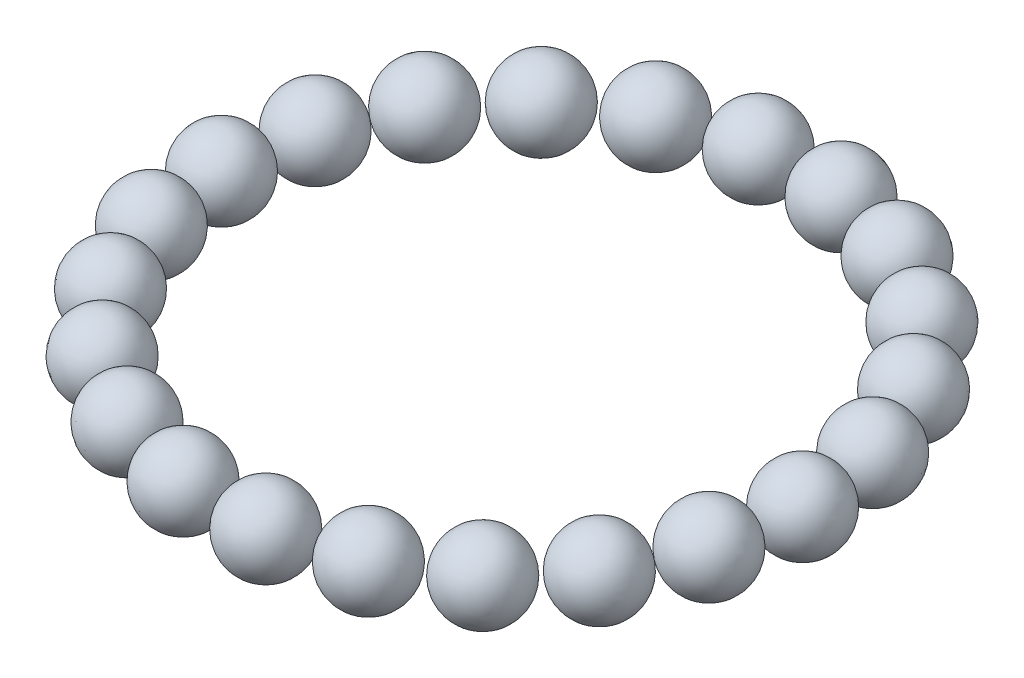
ISO-10303-21;
HEADER;
FILE_DESCRIPTION(('STEP AP214'),'2;1');
FILE_NAME('part.step','',(''),(''),'','','');
FILE_SCHEMA(('AUTOMOTIVE_DESIGN { 1 0 10303 214 1 1 1 1 }'));
ENDSEC;
DATA;
#1=APPLICATION_CONTEXT('core data for automotive mechanical design processes');
#2=APPLICATION_PROTOCOL_DEFINITION('international standard','automotive_design',2000,#1);
#3=PRODUCT_CONTEXT('',#1,'mechanical');
#4=PRODUCT('Part','Part','',(#3));
#5=PRODUCT_RELATED_PRODUCT_CATEGORY('part','',(#4));
#6=PRODUCT_DEFINITION_FORMATION('','',#4);
#7=PRODUCT_DEFINITION_CONTEXT('part definition',#1,'design');
#8=PRODUCT_DEFINITION('design','',#6,#7);
#9=PRODUCT_DEFINITION_SHAPE('','',#8);
#10=(LENGTH_UNIT() NAMED_UNIT(*) SI_UNIT(.MILLI.,.METRE.));
#11=(NAMED_UNIT(*) PLANE_ANGLE_UNIT() SI_UNIT($,.RADIAN.));
#12=(NAMED_UNIT(*) SI_UNIT($,.STERADIAN.) SOLID_ANGLE_UNIT());
#13=UNCERTAINTY_MEASURE_WITH_UNIT(LENGTH_MEASURE(1.E-05),#10,'distance_accuracy_value','');
#14=(GEOMETRIC_REPRESENTATION_CONTEXT(3) GLOBAL_UNCERTAINTY_ASSIGNED_CONTEXT((#13)) GLOBAL_UNIT_ASSIGNED_CONTEXT((#10,
#11,#12)) REPRESENTATION_CONTEXT('',''));
#15=CARTESIAN_POINT('',(0.,0.,0.));
#16=DIRECTION('',(0.,0.,1.));
#17=DIRECTION('',(1.,0.,0.));
#18=AXIS2_PLACEMENT_3D('',#15,#16,#17);
#19=CARTESIAN_POINT('',(22.2995761997745,0.,-6.54774635355182));
#20=DIRECTION('',(0.,1.,0.));
#21=DIRECTION('',(0.959492973614495,0.,-0.281732556841437));
#22=AXIS2_PLACEMENT_3D('',#19,#20,#21);
#23=SPHERICAL_SURFACE('',#22,3.175);
#24=CARTESIAN_POINT('',(22.2995761997745,3.175,-6.54774635355182));
#25=VERTEX_POINT('',#24);
#26=VERTEX_LOOP('',#25);
#27=FACE_BOUND('',#26,.T.);
#28=ADVANCED_FACE('P0_F13',(#27),#23,.T.);
#29=CLOSED_SHELL('',(#28));
#30=MANIFOLD_SOLID_BREP('P0_B1',#29);
#31=CARTESIAN_POINT('',(-23.241,0.,0.));
#32=DIRECTION('',(0.,1.,0.));
#33=DIRECTION('',(-1.,0.,0.));
#34=AXIS2_PLACEMENT_3D('',#31,#32,#33);
#35=SPHERICAL_SURFACE('',#34,3.175);
#36=CARTESIAN_POINT('',(-23.241,3.175,0.));
#37=VERTEX_POINT('',#36);
#38=VERTEX_LOOP('',#37);
#39=FACE_BOUND('',#38,.T.);
#40=ADVANCED_FACE('P1_F13',(#39),#35,.T.);
#41=CLOSED_SHELL('',(#40));
#42=MANIFOLD_SOLID_BREP('P1_B1',#41);
#43=CARTESIAN_POINT('',(19.5515733565294,0.,-12.5650332384857));
#44=DIRECTION('',(0.,1.,0.));
#45=DIRECTION('',(0.841253532831177,0.,-0.540640817455604));
#46=AXIS2_PLACEMENT_3D('',#43,#44,#45);
#47=SPHERICAL_SURFACE('',#46,3.175);
#48=CARTESIAN_POINT('',(19.5515733565294,3.175,-12.5650332384857));
#49=VERTEX_POINT('',#48);
#50=VERTEX_LOOP('',#49);
#51=FACE_BOUND('',#50,.T.);
#52=ADVANCED_FACE('P2_F13',(#51),#47,.T.);
#53=CLOSED_SHELL('',(#52));
#54=MANIFOLD_SOLID_BREP('P2_B1',#53);
#55=CARTESIAN_POINT('',(-22.2995761997745,0.,6.54774635355168));
#56=DIRECTION('',(0.,1.,0.));
#57=DIRECTION('',(-0.959492973614497,0.,0.28173255684143));
#58=AXIS2_PLACEMENT_3D('',#55,#56,#57);
#59=SPHERICAL_SURFACE('',#58,3.175);
#60=CARTESIAN_POINT('',(-22.2995761997745,3.175,6.54774635355168));
#61=VERTEX_POINT('',#60);
#62=VERTEX_LOOP('',#61);
#63=FACE_BOUND('',#62,.T.);
#64=ADVANCED_FACE('P3_F13',(#63),#59,.T.);
#65=CLOSED_SHELL('',(#64));
#66=MANIFOLD_SOLID_BREP('P3_B1',#65);
#67=CARTESIAN_POINT('',(15.2196183176222,0.,-17.5643758575674));
#68=DIRECTION('',(0.,1.,0.));
#69=DIRECTION('',(0.654860733945279,0.,-0.755749574354264));
#70=AXIS2_PLACEMENT_3D('',#67,#68,#69);
#71=SPHERICAL_SURFACE('',#70,3.175);
#72=CARTESIAN_POINT('',(15.2196183176222,3.175,-17.5643758575674));
#73=VERTEX_POINT('',#72);
#74=VERTEX_LOOP('',#73);
#75=FACE_BOUND('',#74,.T.);
#76=ADVANCED_FACE('P4_F13',(#75),#71,.T.);
#77=CLOSED_SHELL('',(#76));
#78=MANIFOLD_SOLID_BREP('P4_B1',#77);
#79=CARTESIAN_POINT('',(-19.5515733565295,0.,12.5650332384856));
#80=DIRECTION('',(0.,1.,0.));
#81=DIRECTION('',(-0.841253532831181,0.,0.540640817455599));
#82=AXIS2_PLACEMENT_3D('',#79,#80,#81);
#83=SPHERICAL_SURFACE('',#82,3.175);
#84=CARTESIAN_POINT('',(-19.5515733565295,3.175,12.5650332384856));
#85=VERTEX_POINT('',#84);
#86=VERTEX_LOOP('',#85);
#87=FACE_BOUND('',#86,.T.);
#88=ADVANCED_FACE('P5_F13',(#87),#83,.T.);
#89=CLOSED_SHELL('',(#88));
#90=MANIFOLD_SOLID_BREP('P5_B1',#89);
#91=CARTESIAN_POINT('',(9.65466031717665,0.,-21.1407572040344));
#92=DIRECTION('',(0.,1.,0.));
#93=DIRECTION('',(0.415415013001878,0.,-0.909631995354522));
#94=AXIS2_PLACEMENT_3D('',#91,#92,#93);
#95=SPHERICAL_SURFACE('',#94,3.175);
#96=CARTESIAN_POINT('',(9.65466031717665,3.175,-21.1407572040344));
#97=VERTEX_POINT('',#96);
#98=VERTEX_LOOP('',#97);
#99=FACE_BOUND('',#98,.T.);
#100=ADVANCED_FACE('P6_F13',(#99),#95,.T.);
#101=CLOSED_SHELL('',(#100));
#102=MANIFOLD_SOLID_BREP('P6_B1',#101);
#103=CARTESIAN_POINT('',(-15.2196183176223,0.,17.5643758575673));
#104=DIRECTION('',(0.,1.,0.));
#105=DIRECTION('',(-0.654860733945284,0.,0.75574957435426));
#106=AXIS2_PLACEMENT_3D('',#103,#104,#105);
#107=SPHERICAL_SURFACE('',#106,3.175);
#108=CARTESIAN_POINT('',(-15.2196183176223,3.175,17.5643758575673));
#109=VERTEX_POINT('',#108);
#110=VERTEX_LOOP('',#109);
#111=FACE_BOUND('',#110,.T.);
#112=ADVANCED_FACE('P7_F13',(#111),#107,.T.);
#113=CLOSED_SHELL('',(#112));
#114=MANIFOLD_SOLID_BREP('P7_B1',#113);
#115=CARTESIAN_POINT('',(3.3075391563092,0.,-23.0044401307548));
#116=DIRECTION('',(0.,1.,0.));
#117=DIRECTION('',(0.142314838273276,0.,-0.989821441880934));
#118=AXIS2_PLACEMENT_3D('',#115,#116,#117);
#119=SPHERICAL_SURFACE('',#118,3.175);
#120=CARTESIAN_POINT('',(3.3075391563092,3.175,-23.0044401307548));
#121=VERTEX_POINT('',#120);
#122=VERTEX_LOOP('',#121);
#123=FACE_BOUND('',#122,.T.);
#124=ADVANCED_FACE('P8_F13',(#123),#119,.T.);
#125=CLOSED_SHELL('',(#124));
#126=MANIFOLD_SOLID_BREP('P8_B1',#125);
#127=CARTESIAN_POINT('',(-9.65466031717679,0.,21.1407572040344));
#128=DIRECTION('',(0.,1.,0.));
#129=DIRECTION('',(-0.415415013001884,0.,0.90963199535452));
#130=AXIS2_PLACEMENT_3D('',#127,#128,#129);
#131=SPHERICAL_SURFACE('',#130,3.175);
#132=CARTESIAN_POINT('',(-9.65466031717679,3.175,21.1407572040344));
#133=VERTEX_POINT('',#132);
#134=VERTEX_LOOP('',#133);
#135=FACE_BOUND('',#134,.T.);
#136=ADVANCED_FACE('P9_F13',(#135),#131,.T.);
#137=CLOSED_SHELL('',(#136));
#138=MANIFOLD_SOLID_BREP('P9_B1',#137);
#139=CARTESIAN_POINT('',(-3.30753915630965,0.,-23.0044401307547));
#140=DIRECTION('',(0.,1.,0.));
#141=DIRECTION('',(-0.142314838273295,0.,-0.989821441880931));
#142=AXIS2_PLACEMENT_3D('',#139,#140,#141);
#143=SPHERICAL_SURFACE('',#142,3.175);
#144=CARTESIAN_POINT('',(-3.30753915630965,3.175,-23.0044401307547));
#145=VERTEX_POINT('',#144);
#146=VERTEX_LOOP('',#145);
#147=FACE_BOUND('',#146,.T.);
#148=ADVANCED_FACE('P10_F13',(#147),#143,.T.);
#149=CLOSED_SHELL('',(#148));
#150=MANIFOLD_SOLID_BREP('P10_B1',#149);
#151=CARTESIAN_POINT('',(-3.30753915630935,0.,23.0044401307548));
#152=DIRECTION('',(0.,1.,0.));
#153=DIRECTION('',(-0.142314838273282,0.,0.989821441880934));
#154=AXIS2_PLACEMENT_3D('',#151,#152,#153);
#155=SPHERICAL_SURFACE('',#154,3.175);
#156=CARTESIAN_POINT('',(-3.30753915630935,3.175,23.0044401307548));
#157=VERTEX_POINT('',#156);
#158=VERTEX_LOOP('',#157);
#159=FACE_BOUND('',#158,.T.);
#160=ADVANCED_FACE('P11_F13',(#159),#155,.T.);
#161=CLOSED_SHELL('',(#160));
#162=MANIFOLD_SOLID_BREP('P11_B1',#161);
#163=CARTESIAN_POINT('',(-9.65466031717707,0.,-21.1407572040342));
#164=DIRECTION('',(0.,1.,0.));
#165=DIRECTION('',(-0.415415013001897,0.,-0.909631995354514));
#166=AXIS2_PLACEMENT_3D('',#163,#164,#165);
#167=SPHERICAL_SURFACE('',#166,3.175);
#168=CARTESIAN_POINT('',(-9.65466031717707,3.175,-21.1407572040342));
#169=VERTEX_POINT('',#168);
#170=VERTEX_LOOP('',#169);
#171=FACE_BOUND('',#170,.T.);
#172=ADVANCED_FACE('P12_F13',(#171),#167,.T.);
#173=CLOSED_SHELL('',(#172));
#174=MANIFOLD_SOLID_BREP('P12_B1',#173);
#175=CARTESIAN_POINT('',(3.3075391563095,0.,23.0044401307547));
#176=DIRECTION('',(0.,1.,0.));
#177=DIRECTION('',(0.142314838273289,0.,0.989821441880932));
#178=AXIS2_PLACEMENT_3D('',#175,#176,#177);
#179=SPHERICAL_SURFACE('',#178,3.175);
#180=CARTESIAN_POINT('',(3.3075391563095,3.175,23.0044401307547));
#181=VERTEX_POINT('',#180);
#182=VERTEX_LOOP('',#181);
#183=FACE_BOUND('',#182,.T.);
#184=ADVANCED_FACE('P13_F13',(#183),#179,.T.);
#185=CLOSED_SHELL('',(#184));
#186=MANIFOLD_SOLID_BREP('P13_B1',#185);
#187=CARTESIAN_POINT('',(9.65466031717692,0.,21.1407572040343));
#188=DIRECTION('',(0.,1.,0.));
#189=DIRECTION('',(0.41541501300189,0.,0.909631995354517));
#190=AXIS2_PLACEMENT_3D('',#187,#188,#189);
#191=SPHERICAL_SURFACE('',#190,3.175);
#192=CARTESIAN_POINT('',(9.65466031717692,3.175,21.1407572040343));
#193=VERTEX_POINT('',#192);
#194=VERTEX_LOOP('',#193);
#195=FACE_BOUND('',#194,.T.);
#196=ADVANCED_FACE('P14_F13',(#195),#191,.T.);
#197=CLOSED_SHELL('',(#196));
#198=MANIFOLD_SOLID_BREP('P14_B1',#197);
#199=CARTESIAN_POINT('',(15.2196183176224,0.,17.5643758575672));
#200=DIRECTION('',(0.,1.,0.));
#201=DIRECTION('',(0.654860733945289,0.,0.755749574354255));
#202=AXIS2_PLACEMENT_3D('',#199,#200,#201);
#203=SPHERICAL_SURFACE('',#202,3.175);
#204=CARTESIAN_POINT('',(15.2196183176224,3.175,17.5643758575672));
#205=VERTEX_POINT('',#204);
#206=VERTEX_LOOP('',#205);
#207=FACE_BOUND('',#206,.T.);
#208=ADVANCED_FACE('P15_F13',(#207),#203,.T.);
#209=CLOSED_SHELL('',(#208));
#210=MANIFOLD_SOLID_BREP('P15_B1',#209);
#211=CARTESIAN_POINT('',(-15.2196183176226,0.,-17.5643758575671));
#212=DIRECTION('',(0.,1.,0.));
#213=DIRECTION('',(-0.654860733945294,0.,-0.755749574354251));
#214=AXIS2_PLACEMENT_3D('',#211,#212,#213);
#215=SPHERICAL_SURFACE('',#214,3.175);
#216=CARTESIAN_POINT('',(-15.2196183176226,3.175,-17.5643758575671));
#217=VERTEX_POINT('',#216);
#218=VERTEX_LOOP('',#217);
#219=FACE_BOUND('',#218,.T.);
#220=ADVANCED_FACE('P16_F13',(#219),#215,.T.);
#221=CLOSED_SHELL('',(#220));
#222=MANIFOLD_SOLID_BREP('P16_B1',#221);
#223=CARTESIAN_POINT('',(-19.5515733565296,0.,-12.5650332384853));
#224=DIRECTION('',(0.,1.,0.));
#225=DIRECTION('',(-0.841253532831188,0.,-0.540640817455587));
#226=AXIS2_PLACEMENT_3D('',#223,#224,#225);
#227=SPHERICAL_SURFACE('',#226,3.175);
#228=CARTESIAN_POINT('',(-19.5515733565296,3.175,-12.5650332384853));
#229=VERTEX_POINT('',#228);
#230=VERTEX_LOOP('',#229);
#231=FACE_BOUND('',#230,.T.);
#232=ADVANCED_FACE('P17_F13',(#231),#227,.T.);
#233=CLOSED_SHELL('',(#232));
#234=MANIFOLD_SOLID_BREP('P17_B1',#233);
#235=CARTESIAN_POINT('',(19.5515733565295,0.,12.5650332384854));
#236=DIRECTION('',(0.,1.,0.));
#237=DIRECTION('',(0.841253532831184,0.,0.540640817455593));
#238=AXIS2_PLACEMENT_3D('',#235,#236,#237);
#239=SPHERICAL_SURFACE('',#238,3.175);
#240=CARTESIAN_POINT('',(19.5515733565295,3.175,12.5650332384854));
#241=VERTEX_POINT('',#240);
#242=VERTEX_LOOP('',#241);
#243=FACE_BOUND('',#242,.T.);
#244=ADVANCED_FACE('P18_F13',(#243),#239,.T.);
#245=CLOSED_SHELL('',(#244));
#246=MANIFOLD_SOLID_BREP('P18_B1',#245);
#247=CARTESIAN_POINT('',(-22.2995761997746,0.,-6.54774635355139));
#248=DIRECTION('',(0.,1.,0.));
#249=DIRECTION('',(-0.959492973614501,0.,-0.281732556841418));
#250=AXIS2_PLACEMENT_3D('',#247,#248,#249);
#251=SPHERICAL_SURFACE('',#250,3.175);
#252=CARTESIAN_POINT('',(-22.2995761997746,3.175,-6.54774635355139));
#253=VERTEX_POINT('',#252);
#254=VERTEX_LOOP('',#253);
#255=FACE_BOUND('',#254,.T.);
#256=ADVANCED_FACE('P19_F13',(#255),#251,.T.);
#257=CLOSED_SHELL('',(#256));
#258=MANIFOLD_SOLID_BREP('P19_B1',#257);
#259=CARTESIAN_POINT('',(22.2995761997746,0.,6.54774635355153));
#260=DIRECTION('',(0.,1.,0.));
#261=DIRECTION('',(0.959492973614499,0.,0.281732556841424));
#262=AXIS2_PLACEMENT_3D('',#259,#260,#261);
#263=SPHERICAL_SURFACE('',#262,3.175);
#264=CARTESIAN_POINT('',(22.2995761997746,3.175,6.54774635355153));
#265=VERTEX_POINT('',#264);
#266=VERTEX_LOOP('',#265);
#267=FACE_BOUND('',#266,.T.);
#268=ADVANCED_FACE('P20_F13',(#267),#263,.T.);
#269=CLOSED_SHELL('',(#268));
#270=MANIFOLD_SOLID_BREP('P20_B1',#269);
#271=CARTESIAN_POINT('',(23.241,0.,-1.52655665885959E-13));
#272=DIRECTION('',(0.,1.,0.));
#273=DIRECTION('',(1.,0.,0.));
#274=AXIS2_PLACEMENT_3D('',#271,#272,#273);
#275=SPHERICAL_SURFACE('',#274,3.175);
#276=CARTESIAN_POINT('',(23.241,3.175,-1.52655665885959E-13));
#277=VERTEX_POINT('',#276);
#278=VERTEX_LOOP('',#277);
#279=FACE_BOUND('',#278,.T.);
#280=ADVANCED_FACE('P21_F13',(#279),#275,.T.);
#281=CLOSED_SHELL('',(#280));
#282=MANIFOLD_SOLID_BREP('P21_B1',#281);
#283=ADVANCED_BREP_SHAPE_REPRESENTATION('',(#18,#30,#42,#54,#66,#78,#90,#102,#114,#126,#138,
#150,#162,#174,#186,#198,#210,#222,#234,#246,#258,#270,#282),#14);
#284=SHAPE_DEFINITION_REPRESENTATION(#9,#283);
ENDSEC;
END-ISO-10303-21;
